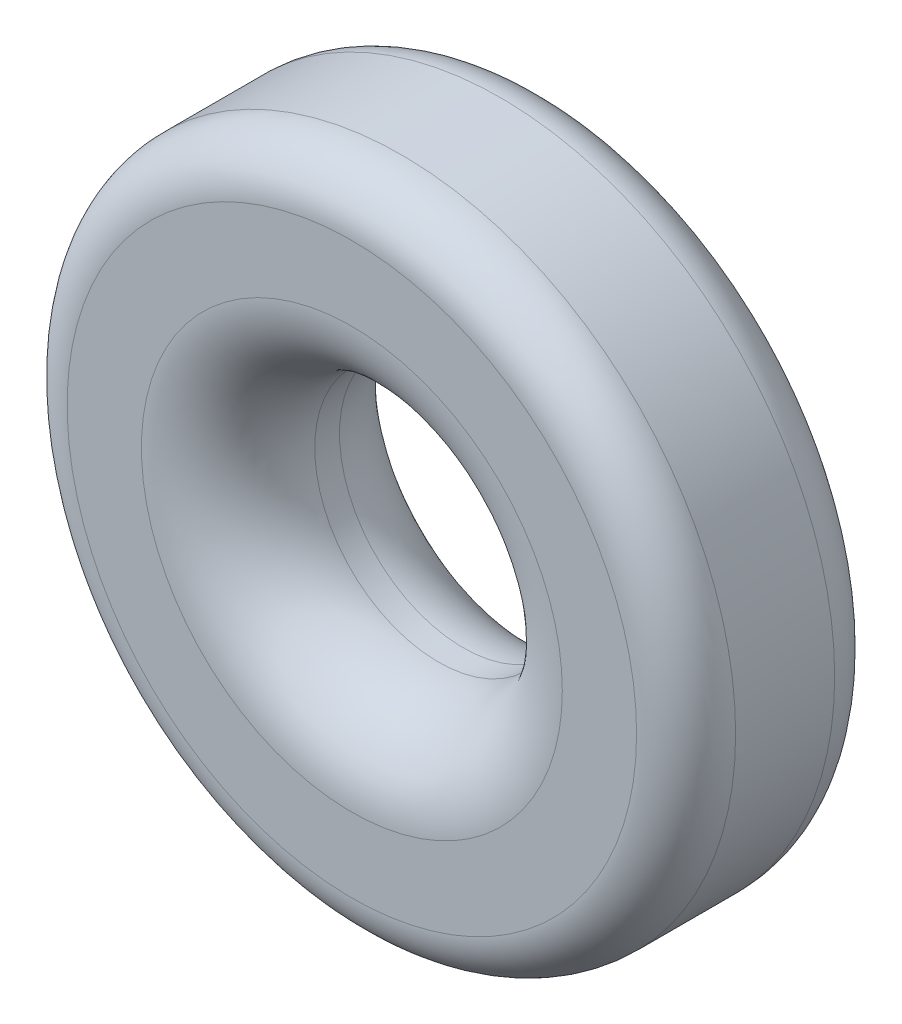
ISO-10303-21;
HEADER;
FILE_DESCRIPTION(('STEP AP214'),'2;1');
FILE_NAME('part.step','',(''),(''),'','','');
FILE_SCHEMA(('AUTOMOTIVE_DESIGN { 1 0 10303 214 1 1 1 1 }'));
ENDSEC;
DATA;
#1=APPLICATION_CONTEXT('core data for automotive mechanical design processes');
#2=APPLICATION_PROTOCOL_DEFINITION('international standard','automotive_design',2000,#1);
#3=PRODUCT_CONTEXT('',#1,'mechanical');
#4=PRODUCT('Part','Part','',(#3));
#5=PRODUCT_RELATED_PRODUCT_CATEGORY('part','',(#4));
#6=PRODUCT_DEFINITION_FORMATION('','',#4);
#7=PRODUCT_DEFINITION_CONTEXT('part definition',#1,'design');
#8=PRODUCT_DEFINITION('design','',#6,#7);
#9=PRODUCT_DEFINITION_SHAPE('','',#8);
#10=(LENGTH_UNIT() NAMED_UNIT(*) SI_UNIT(.MILLI.,.METRE.));
#11=(NAMED_UNIT(*) PLANE_ANGLE_UNIT() SI_UNIT($,.RADIAN.));
#12=(NAMED_UNIT(*) SI_UNIT($,.STERADIAN.) SOLID_ANGLE_UNIT());
#13=UNCERTAINTY_MEASURE_WITH_UNIT(LENGTH_MEASURE(1.E-05),#10,'distance_accuracy_value','');
#14=(GEOMETRIC_REPRESENTATION_CONTEXT(3) GLOBAL_UNCERTAINTY_ASSIGNED_CONTEXT((#13)) GLOBAL_UNIT_ASSIGNED_CONTEXT((#10,
#11,#12)) REPRESENTATION_CONTEXT('',''));
#15=CARTESIAN_POINT('',(0.,0.,0.));
#16=DIRECTION('',(0.,0.,1.));
#17=DIRECTION('',(1.,0.,0.));
#18=AXIS2_PLACEMENT_3D('',#15,#16,#17);
#19=CARTESIAN_POINT('',(0.,0.,80.));
#20=DIRECTION('',(0.,0.,1.));
#21=DIRECTION('',(1.,0.,0.));
#22=AXIS2_PLACEMENT_3D('',#19,#20,#21);
#23=PLANE('',#22);
#24=CARTESIAN_POINT('',(0.,0.,80.));
#25=DIRECTION('',(0.,0.,1.));
#26=DIRECTION('',(1.,0.,0.));
#27=AXIS2_PLACEMENT_3D('',#24,#25,#26);
#28=CIRCLE('',#27,85.);
#29=CARTESIAN_POINT('',(85.,0.,80.));
#30=VERTEX_POINT('',#29);
#31=EDGE_CURVE('E10',#30,#30,#28,.F.);
#32=ORIENTED_EDGE('',*,*,#31,.T.);
#33=EDGE_LOOP('',(#32));
#34=FACE_BOUND('',#33,.T.);
#35=CARTESIAN_POINT('',(0.,0.,80.));
#36=DIRECTION('',(0.,0.,1.));
#37=DIRECTION('',(1.,0.,0.));
#38=AXIS2_PLACEMENT_3D('',#35,#36,#37);
#39=CIRCLE('',#38,115.);
#40=CARTESIAN_POINT('',(115.,0.,80.));
#41=VERTEX_POINT('',#40);
#42=EDGE_CURVE('E53',#41,#41,#39,.T.);
#43=ORIENTED_EDGE('',*,*,#42,.T.);
#44=EDGE_LOOP('',(#43));
#45=FACE_BOUND('',#44,.T.);
#46=ADVANCED_FACE('F30',(#34,#45),#23,.T.);
#47=CARTESIAN_POINT('',(0.,0.,0.));
#48=DIRECTION('',(0.,0.,1.));
#49=DIRECTION('',(1.,0.,0.));
#50=AXIS2_PLACEMENT_3D('',#47,#48,#49);
#51=PLANE('',#50);
#52=CARTESIAN_POINT('',(0.,0.,0.));
#53=DIRECTION('',(0.,0.,1.));
#54=DIRECTION('',(1.,0.,0.));
#55=AXIS2_PLACEMENT_3D('',#52,#53,#54);
#56=CIRCLE('',#55,85.);
#57=CARTESIAN_POINT('',(85.,0.,0.));
#58=VERTEX_POINT('',#57);
#59=EDGE_CURVE('E45',#58,#58,#56,.T.);
#60=ORIENTED_EDGE('',*,*,#59,.T.);
#61=EDGE_LOOP('',(#60));
#62=FACE_BOUND('',#61,.T.);
#63=CARTESIAN_POINT('',(0.,0.,0.));
#64=DIRECTION('',(0.,0.,1.));
#65=DIRECTION('',(1.,0.,0.));
#66=AXIS2_PLACEMENT_3D('',#63,#64,#65);
#67=CIRCLE('',#66,115.);
#68=CARTESIAN_POINT('',(115.,0.,0.));
#69=VERTEX_POINT('',#68);
#70=EDGE_CURVE('E56',#69,#69,#67,.F.);
#71=ORIENTED_EDGE('',*,*,#70,.T.);
#72=EDGE_LOOP('',(#71));
#73=FACE_BOUND('',#72,.T.);
#74=ADVANCED_FACE('F82',(#62,#73),#51,.F.);
#75=CARTESIAN_POINT('',(0.,0.,80.));
#76=DIRECTION('',(0.,0.,-1.));
#77=DIRECTION('',(-1.,0.,0.));
#78=AXIS2_PLACEMENT_3D('',#75,#76,#77);
#79=CYLINDRICAL_SURFACE('',#78,135.);
#80=CARTESIAN_POINT('',(0.,0.,60.));
#81=DIRECTION('',(0.,0.,1.));
#82=DIRECTION('',(1.,0.,0.));
#83=AXIS2_PLACEMENT_3D('',#80,#81,#82);
#84=CIRCLE('',#83,135.);
#85=CARTESIAN_POINT('',(135.,0.,60.));
#86=VERTEX_POINT('',#85);
#87=EDGE_CURVE('E50',#86,#86,#84,.F.);
#88=ORIENTED_EDGE('',*,*,#87,.T.);
#89=EDGE_LOOP('',(#88));
#90=FACE_BOUND('',#89,.T.);
#91=CARTESIAN_POINT('',(0.,0.,20.));
#92=DIRECTION('',(0.,0.,1.));
#93=DIRECTION('',(1.,0.,0.));
#94=AXIS2_PLACEMENT_3D('',#91,#92,#93);
#95=CIRCLE('',#94,135.);
#96=CARTESIAN_POINT('',(135.,0.,20.));
#97=VERTEX_POINT('',#96);
#98=EDGE_CURVE('E59',#97,#97,#95,.T.);
#99=ORIENTED_EDGE('',*,*,#98,.T.);
#100=EDGE_LOOP('',(#99));
#101=FACE_BOUND('',#100,.T.);
#102=ADVANCED_FACE('F63',(#90,#101),#79,.T.);
#103=CARTESIAN_POINT('',(0.,0.,80.));
#104=DIRECTION('',(0.,0.,-1.));
#105=DIRECTION('',(-1.,0.,0.));
#106=AXIS2_PLACEMENT_3D('',#103,#104,#105);
#107=CYLINDRICAL_SURFACE('',#106,50.);
#108=CARTESIAN_POINT('',(0.,0.,45.));
#109=DIRECTION('',(0.,0.,1.));
#110=DIRECTION('',(1.,0.,0.));
#111=AXIS2_PLACEMENT_3D('',#108,#109,#110);
#112=CIRCLE('',#111,50.);
#113=CARTESIAN_POINT('',(50.,0.,45.));
#114=VERTEX_POINT('',#113);
#115=EDGE_CURVE('E37',#114,#114,#112,.T.);
#116=ORIENTED_EDGE('',*,*,#115,.T.);
#117=EDGE_LOOP('',(#116));
#118=FACE_BOUND('',#117,.T.);
#119=CARTESIAN_POINT('',(0.,0.,35.));
#120=DIRECTION('',(0.,0.,1.));
#121=DIRECTION('',(1.,0.,0.));
#122=AXIS2_PLACEMENT_3D('',#119,#120,#121);
#123=CIRCLE('',#122,50.);
#124=CARTESIAN_POINT('',(50.,0.,35.));
#125=VERTEX_POINT('',#124);
#126=EDGE_CURVE('E41',#125,#125,#123,.F.);
#127=ORIENTED_EDGE('',*,*,#126,.T.);
#128=EDGE_LOOP('',(#127));
#129=FACE_BOUND('',#128,.T.);
#130=ADVANCED_FACE('F68',(#118,#129),#107,.F.);
#131=CARTESIAN_POINT('',(0.,0.,20.));
#132=DIRECTION('',(0.,0.,1.));
#133=DIRECTION('',(1.,0.,0.));
#134=AXIS2_PLACEMENT_3D('',#131,#132,#133);
#135=TOROIDAL_SURFACE('',#134,115.,20.);
#136=ORIENTED_EDGE('',*,*,#70,.F.);
#137=EDGE_LOOP('',(#136));
#138=FACE_BOUND('',#137,.T.);
#139=ORIENTED_EDGE('',*,*,#98,.F.);
#140=EDGE_LOOP('',(#139));
#141=FACE_BOUND('',#140,.T.);
#142=ADVANCED_FACE('F65',(#138,#141),#135,.T.);
#143=CARTESIAN_POINT('',(0.,0.,60.));
#144=DIRECTION('',(0.,0.,1.));
#145=DIRECTION('',(1.,0.,0.));
#146=AXIS2_PLACEMENT_3D('',#143,#144,#145);
#147=TOROIDAL_SURFACE('',#146,115.,20.);
#148=ORIENTED_EDGE('',*,*,#87,.F.);
#149=EDGE_LOOP('',(#148));
#150=FACE_BOUND('',#149,.T.);
#151=ORIENTED_EDGE('',*,*,#42,.F.);
#152=EDGE_LOOP('',(#151));
#153=FACE_BOUND('',#152,.T.);
#154=ADVANCED_FACE('F67',(#150,#153),#147,.T.);
#155=CARTESIAN_POINT('',(0.,0.,35.));
#156=DIRECTION('',(0.,0.,1.));
#157=DIRECTION('',(1.,0.,0.));
#158=AXIS2_PLACEMENT_3D('',#155,#156,#157);
#159=TOROIDAL_SURFACE('',#158,85.,35.);
#160=ORIENTED_EDGE('',*,*,#126,.F.);
#161=EDGE_LOOP('',(#160));
#162=FACE_BOUND('',#161,.T.);
#163=ORIENTED_EDGE('',*,*,#59,.F.);
#164=EDGE_LOOP('',(#163));
#165=FACE_BOUND('',#164,.T.);
#166=ADVANCED_FACE('F75',(#162,#165),#159,.T.);
#167=CARTESIAN_POINT('',(0.,0.,45.));
#168=DIRECTION('',(0.,0.,1.));
#169=DIRECTION('',(1.,0.,0.));
#170=AXIS2_PLACEMENT_3D('',#167,#168,#169);
#171=TOROIDAL_SURFACE('',#170,85.,35.);
#172=ORIENTED_EDGE('',*,*,#31,.F.);
#173=EDGE_LOOP('',(#172));
#174=FACE_BOUND('',#173,.T.);
#175=ORIENTED_EDGE('',*,*,#115,.F.);
#176=EDGE_LOOP('',(#175));
#177=FACE_BOUND('',#176,.T.);
#178=ADVANCED_FACE('F32',(#174,#177),#171,.T.);
#179=CLOSED_SHELL('',(#46,#74,#102,#130,#142,#154,#166,#178));
#180=MANIFOLD_SOLID_BREP('B2',#179);
#181=ADVANCED_BREP_SHAPE_REPRESENTATION('',(#18,#180),#14);
#182=SHAPE_DEFINITION_REPRESENTATION(#9,#181);
ENDSEC;
END-ISO-10303-21;
